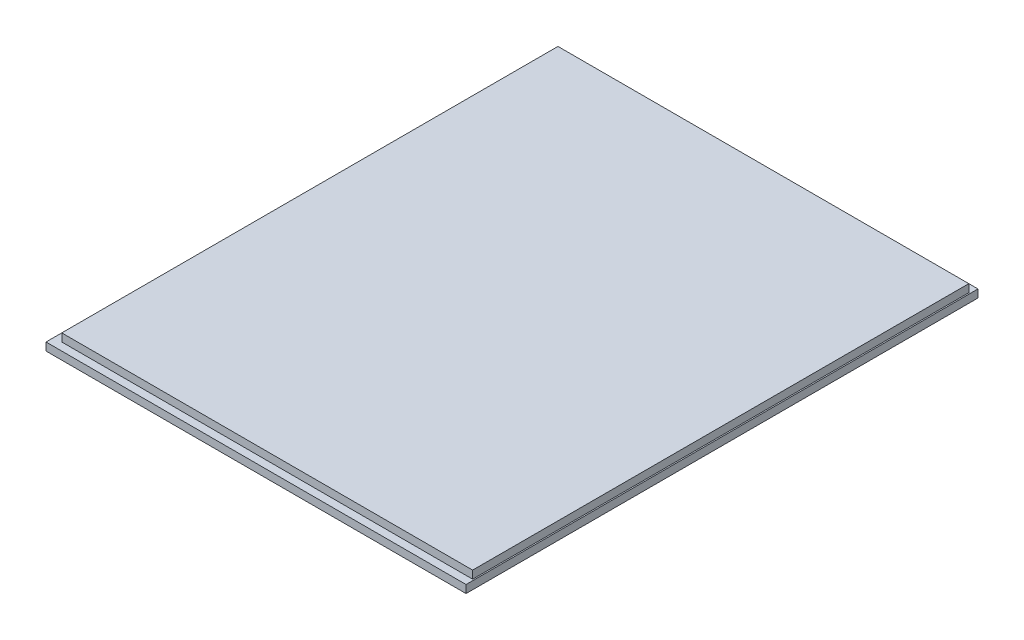
ISO-10303-21;
HEADER;
FILE_DESCRIPTION(('STEP AP214'),'2;1');
FILE_NAME('part.step','',(''),(''),'','','');
FILE_SCHEMA(('AUTOMOTIVE_DESIGN { 1 0 10303 214 1 1 1 1 }'));
ENDSEC;
DATA;
#1=APPLICATION_CONTEXT('core data for automotive mechanical design processes');
#2=APPLICATION_PROTOCOL_DEFINITION('international standard','automotive_design',2000,#1);
#3=PRODUCT_CONTEXT('',#1,'mechanical');
#4=PRODUCT('Part','Part','',(#3));
#5=PRODUCT_RELATED_PRODUCT_CATEGORY('part','',(#4));
#6=PRODUCT_DEFINITION_FORMATION('','',#4);
#7=PRODUCT_DEFINITION_CONTEXT('part definition',#1,'design');
#8=PRODUCT_DEFINITION('design','',#6,#7);
#9=PRODUCT_DEFINITION_SHAPE('','',#8);
#10=(LENGTH_UNIT() NAMED_UNIT(*) SI_UNIT(.MILLI.,.METRE.));
#11=(NAMED_UNIT(*) PLANE_ANGLE_UNIT() SI_UNIT($,.RADIAN.));
#12=(NAMED_UNIT(*) SI_UNIT($,.STERADIAN.) SOLID_ANGLE_UNIT());
#13=UNCERTAINTY_MEASURE_WITH_UNIT(LENGTH_MEASURE(1.E-05),#10,'distance_accuracy_value','');
#14=(GEOMETRIC_REPRESENTATION_CONTEXT(3) GLOBAL_UNCERTAINTY_ASSIGNED_CONTEXT((#13)) GLOBAL_UNIT_ASSIGNED_CONTEXT((#10,
#11,#12)) REPRESENTATION_CONTEXT('',''));
#15=CARTESIAN_POINT('',(0.,0.,0.));
#16=DIRECTION('',(0.,0.,1.));
#17=DIRECTION('',(1.,0.,0.));
#18=AXIS2_PLACEMENT_3D('',#15,#16,#17);
#19=CARTESIAN_POINT('',(-94.1664682539683,-3.81,-117.475));
#20=DIRECTION('',(1.,0.,0.));
#21=DIRECTION('',(0.,0.,-1.));
#22=AXIS2_PLACEMENT_3D('',#19,#20,#21);
#23=PLANE('',#22);
#24=DIRECTION('',(0.,0.,-1.));
#25=VECTOR('',#24,1.);
#26=CARTESIAN_POINT('',(-94.1664682539683,-3.81,-117.475));
#27=LINE('',#26,#25);
#28=CARTESIAN_POINT('',(-94.1664682539683,-3.81,115.444461816373));
#29=VERTEX_POINT('',#28);
#30=CARTESIAN_POINT('',(-94.1664682539683,-3.81,-115.444461816373));
#31=VERTEX_POINT('',#30);
#32=EDGE_CURVE('E53',#29,#31,#27,.T.);
#33=ORIENTED_EDGE('',*,*,#32,.T.);
#34=DIRECTION('',(0.,1.,0.));
#35=VECTOR('',#34,1.);
#36=CARTESIAN_POINT('',(-94.1664682539683,-304.925920325881,-115.444461816373));
#37=LINE('',#36,#35);
#38=CARTESIAN_POINT('',(-94.1664682539684,0.,-115.444461816374));
#39=VERTEX_POINT('',#38);
#40=EDGE_CURVE('E310',#31,#39,#37,.T.);
#41=ORIENTED_EDGE('',*,*,#40,.T.);
#42=DIRECTION('',(0.,0.,-1.));
#43=VECTOR('',#42,1.);
#44=CARTESIAN_POINT('',(-94.1664682539683,0.,-117.475));
#45=LINE('',#44,#43);
#46=CARTESIAN_POINT('',(-94.1664682539683,0.,115.444461816373));
#47=VERTEX_POINT('',#46);
#48=EDGE_CURVE('E337',#47,#39,#45,.T.);
#49=ORIENTED_EDGE('',*,*,#48,.F.);
#50=DIRECTION('',(0.,1.,0.));
#51=VECTOR('',#50,1.);
#52=CARTESIAN_POINT('',(-94.1664682539683,-304.925920325881,115.444461816373));
#53=LINE('',#52,#51);
#54=EDGE_CURVE('E61',#29,#47,#53,.T.);
#55=ORIENTED_EDGE('',*,*,#54,.F.);
#56=EDGE_LOOP('',(#33,#41,#49,#55));
#57=FACE_BOUND('',#56,.T.);
#58=ADVANCED_FACE('F38',(#57),#23,.T.);
#59=CARTESIAN_POINT('',(94.1664682539683,-3.81,-117.475));
#60=DIRECTION('',(0.,0.,1.));
#61=DIRECTION('',(1.,0.,0.));
#62=AXIS2_PLACEMENT_3D('',#59,#60,#61);
#63=PLANE('',#62);
#64=DIRECTION('',(1.,0.,0.));
#65=VECTOR('',#64,1.);
#66=CARTESIAN_POINT('',(94.1664682539683,-3.81,-117.475));
#67=LINE('',#66,#65);
#68=CARTESIAN_POINT('',(-92.5388146305852,-3.81,-117.475));
#69=VERTEX_POINT('',#68);
#70=CARTESIAN_POINT('',(92.5388146305852,-3.81,-117.475));
#71=VERTEX_POINT('',#70);
#72=EDGE_CURVE('E345',#69,#71,#67,.T.);
#73=ORIENTED_EDGE('',*,*,#72,.T.);
#74=DIRECTION('',(0.,1.,0.));
#75=VECTOR('',#74,1.);
#76=CARTESIAN_POINT('',(92.5388146305852,-304.925920325881,-117.475));
#77=LINE('',#76,#75);
#78=CARTESIAN_POINT('',(92.5388146305852,0.,-117.475));
#79=VERTEX_POINT('',#78);
#80=EDGE_CURVE('E299',#71,#79,#77,.T.);
#81=ORIENTED_EDGE('',*,*,#80,.T.);
#82=DIRECTION('',(1.,0.,0.));
#83=VECTOR('',#82,1.);
#84=CARTESIAN_POINT('',(94.1664682539683,0.,-117.475));
#85=LINE('',#84,#83);
#86=CARTESIAN_POINT('',(-92.5388146305852,0.,-117.475));
#87=VERTEX_POINT('',#86);
#88=EDGE_CURVE('E358',#87,#79,#85,.T.);
#89=ORIENTED_EDGE('',*,*,#88,.F.);
#90=DIRECTION('',(0.,1.,0.));
#91=VECTOR('',#90,1.);
#92=CARTESIAN_POINT('',(-92.5388146305852,-304.925920325881,-117.475));
#93=LINE('',#92,#91);
#94=EDGE_CURVE('E307',#69,#87,#93,.T.);
#95=ORIENTED_EDGE('',*,*,#94,.F.);
#96=EDGE_LOOP('',(#73,#81,#89,#95));
#97=FACE_BOUND('',#96,.T.);
#98=ADVANCED_FACE('F503',(#97),#63,.T.);
#99=CARTESIAN_POINT('',(94.1664682539683,-3.81,-117.475));
#100=DIRECTION('',(-1.,0.,0.));
#101=DIRECTION('',(0.,0.,1.));
#102=AXIS2_PLACEMENT_3D('',#99,#100,#101);
#103=PLANE('',#102);
#104=DIRECTION('',(0.,0.,1.));
#105=VECTOR('',#104,1.);
#106=CARTESIAN_POINT('',(94.1664682539683,-3.81,-117.475));
#107=LINE('',#106,#105);
#108=CARTESIAN_POINT('',(94.1664682539683,-3.81,-115.444461816373));
#109=VERTEX_POINT('',#108);
#110=CARTESIAN_POINT('',(94.1664682539683,-3.81,115.444461816373));
#111=VERTEX_POINT('',#110);
#112=EDGE_CURVE('E349',#109,#111,#107,.T.);
#113=ORIENTED_EDGE('',*,*,#112,.T.);
#114=DIRECTION('',(0.,1.,0.));
#115=VECTOR('',#114,1.);
#116=CARTESIAN_POINT('',(94.1664682539683,-304.925920325881,115.444461816373));
#117=LINE('',#116,#115);
#118=CARTESIAN_POINT('',(94.1664682539683,0.,115.444461816373));
#119=VERTEX_POINT('',#118);
#120=EDGE_CURVE('E333',#111,#119,#117,.T.);
#121=ORIENTED_EDGE('',*,*,#120,.T.);
#122=DIRECTION('',(0.,0.,1.));
#123=VECTOR('',#122,1.);
#124=CARTESIAN_POINT('',(94.1664682539683,0.,-117.475));
#125=LINE('',#124,#123);
#126=CARTESIAN_POINT('',(94.1664682539683,0.,-115.444461816373));
#127=VERTEX_POINT('',#126);
#128=EDGE_CURVE('E362',#127,#119,#125,.T.);
#129=ORIENTED_EDGE('',*,*,#128,.F.);
#130=DIRECTION('',(0.,1.,0.));
#131=VECTOR('',#130,1.);
#132=CARTESIAN_POINT('',(94.1664682539683,-304.925920325881,-115.444461816373));
#133=LINE('',#132,#131);
#134=EDGE_CURVE('E253',#109,#127,#133,.T.);
#135=ORIENTED_EDGE('',*,*,#134,.F.);
#136=EDGE_LOOP('',(#113,#121,#129,#135));
#137=FACE_BOUND('',#136,.T.);
#138=ADVANCED_FACE('F508',(#137),#103,.T.);
#139=CARTESIAN_POINT('',(94.1664682539683,-3.81,117.475));
#140=DIRECTION('',(0.,0.,-1.));
#141=DIRECTION('',(-1.,0.,0.));
#142=AXIS2_PLACEMENT_3D('',#139,#140,#141);
#143=PLANE('',#142);
#144=DIRECTION('',(-1.,0.,0.));
#145=VECTOR('',#144,1.);
#146=CARTESIAN_POINT('',(94.1664682539683,-3.81,117.475));
#147=LINE('',#146,#145);
#148=CARTESIAN_POINT('',(92.5388146305851,-3.81,117.475));
#149=VERTEX_POINT('',#148);
#150=CARTESIAN_POINT('',(-92.5388146305852,-3.81,117.475));
#151=VERTEX_POINT('',#150);
#152=EDGE_CURVE('E351',#149,#151,#147,.T.);
#153=ORIENTED_EDGE('',*,*,#152,.T.);
#154=DIRECTION('',(0.,1.,0.));
#155=VECTOR('',#154,1.);
#156=CARTESIAN_POINT('',(-92.5388146305852,-304.925920325881,117.475));
#157=LINE('',#156,#155);
#158=CARTESIAN_POINT('',(-92.5388146305852,0.,117.475));
#159=VERTEX_POINT('',#158);
#160=EDGE_CURVE('E321',#151,#159,#157,.T.);
#161=ORIENTED_EDGE('',*,*,#160,.T.);
#162=DIRECTION('',(-1.,0.,0.));
#163=VECTOR('',#162,1.);
#164=CARTESIAN_POINT('',(94.1664682539683,0.,117.475));
#165=LINE('',#164,#163);
#166=CARTESIAN_POINT('',(92.5388146305851,0.,117.475));
#167=VERTEX_POINT('',#166);
#168=EDGE_CURVE('E346',#167,#159,#165,.T.);
#169=ORIENTED_EDGE('',*,*,#168,.F.);
#170=DIRECTION('',(0.,1.,0.));
#171=VECTOR('',#170,1.);
#172=CARTESIAN_POINT('',(92.5388146305851,-304.925920325881,117.475));
#173=LINE('',#172,#171);
#174=EDGE_CURVE('E330',#149,#167,#173,.T.);
#175=ORIENTED_EDGE('',*,*,#174,.F.);
#176=EDGE_LOOP('',(#153,#161,#169,#175));
#177=FACE_BOUND('',#176,.T.);
#178=ADVANCED_FACE('F776',(#177),#143,.T.);
#179=CARTESIAN_POINT('',(0.,0.,0.));
#180=DIRECTION('',(0.,1.,0.));
#181=DIRECTION('',(0.,0.,1.));
#182=AXIS2_PLACEMENT_3D('',#179,#180,#181);
#183=PLANE('',#182);
#184=DIRECTION('',(0.625449947329634,0.,-0.780264290728057));
#185=VECTOR('',#184,1.);
#186=CARTESIAN_POINT('',(92.5388146305852,0.,-117.475));
#187=LINE('',#186,#185);
#188=CARTESIAN_POINT('',(19.4474117164525,0.,-26.2916656714782));
#189=VERTEX_POINT('',#188);
#190=EDGE_CURVE('E296',#189,#79,#187,.T.);
#191=ORIENTED_EDGE('',*,*,#190,.F.);
#192=CARTESIAN_POINT('',(0.,0.,0.));
#193=DIRECTION('',(0.,-1.,0.));
#194=DIRECTION('',(0.,0.,-1.));
#195=AXIS2_PLACEMENT_3D('',#192,#193,#194);
#196=CIRCLE('',#195,32.7025);
#197=CARTESIAN_POINT('',(-19.4474117164525,0.,-26.2916656714782));
#198=VERTEX_POINT('',#197);
#199=EDGE_CURVE('E293',#198,#189,#196,.T.);
#200=ORIENTED_EDGE('',*,*,#199,.F.);
#201=DIRECTION('',(0.625449947329634,0.,0.780264290728057));
#202=VECTOR('',#201,1.);
#203=CARTESIAN_POINT('',(-19.4474117164525,0.,-26.2916656714782));
#204=LINE('',#203,#202);
#205=EDGE_CURVE('E289',#87,#198,#204,.T.);
#206=ORIENTED_EDGE('',*,*,#205,.F.);
#207=ORIENTED_EDGE('',*,*,#88,.T.);
#208=EDGE_LOOP('',(#191,#200,#206,#207));
#209=FACE_BOUND('',#208,.T.);
#210=ADVANCED_FACE('F558',(#209),#183,.F.);
#211=DIRECTION('',(-0.625449947329634,0.,-0.780264290728057));
#212=VECTOR('',#211,1.);
#213=CARTESIAN_POINT('',(-94.1664682539683,0.,-115.444461816373));
#214=LINE('',#213,#212);
#215=CARTESIAN_POINT('',(-21.4292830149018,0.,-24.7030228052609));
#216=VERTEX_POINT('',#215);
#217=EDGE_CURVE('E285',#216,#39,#214,.T.);
#218=ORIENTED_EDGE('',*,*,#217,.F.);
#219=CARTESIAN_POINT('',(0.,0.,0.));
#220=DIRECTION('',(0.,-1.,0.));
#221=DIRECTION('',(0.,0.,-1.));
#222=AXIS2_PLACEMENT_3D('',#219,#220,#221);
#223=CIRCLE('',#222,32.7025);
#224=CARTESIAN_POINT('',(-21.4292830149019,0.,24.7030228052609));
#225=VERTEX_POINT('',#224);
#226=EDGE_CURVE('E281',#225,#216,#223,.T.);
#227=ORIENTED_EDGE('',*,*,#226,.F.);
#228=DIRECTION('',(0.625449947329634,0.,-0.780264290728057));
#229=VECTOR('',#228,1.);
#230=CARTESIAN_POINT('',(-21.4292830149019,0.,24.7030228052609));
#231=LINE('',#230,#229);
#232=EDGE_CURVE('E277',#47,#225,#231,.T.);
#233=ORIENTED_EDGE('',*,*,#232,.F.);
#234=ORIENTED_EDGE('',*,*,#48,.T.);
#235=EDGE_LOOP('',(#218,#227,#233,#234));
#236=FACE_BOUND('',#235,.T.);
#237=ADVANCED_FACE('F792',(#236),#183,.F.);
#238=DIRECTION('',(-0.625449947329634,0.,0.780264290728057));
#239=VECTOR('',#238,1.);
#240=CARTESIAN_POINT('',(-92.5388146305852,0.,117.475));
#241=LINE('',#240,#239);
#242=CARTESIAN_POINT('',(-19.4474117164526,0.,26.2916656714782));
#243=VERTEX_POINT('',#242);
#244=EDGE_CURVE('E273',#243,#159,#241,.T.);
#245=ORIENTED_EDGE('',*,*,#244,.F.);
#246=CARTESIAN_POINT('',(0.,0.,0.));
#247=DIRECTION('',(0.,-1.,0.));
#248=DIRECTION('',(0.,0.,-1.));
#249=AXIS2_PLACEMENT_3D('',#246,#247,#248);
#250=CIRCLE('',#249,32.7025);
#251=CARTESIAN_POINT('',(19.4474117164526,0.,26.2916656714782));
#252=VERTEX_POINT('',#251);
#253=EDGE_CURVE('E270',#252,#243,#250,.T.);
#254=ORIENTED_EDGE('',*,*,#253,.F.);
#255=DIRECTION('',(-0.625449947329634,0.,-0.780264290728057));
#256=VECTOR('',#255,1.);
#257=CARTESIAN_POINT('',(19.4474117164526,0.,26.2916656714782));
#258=LINE('',#257,#256);
#259=EDGE_CURVE('E267',#167,#252,#258,.T.);
#260=ORIENTED_EDGE('',*,*,#259,.F.);
#261=ORIENTED_EDGE('',*,*,#168,.T.);
#262=EDGE_LOOP('',(#245,#254,#260,#261));
#263=FACE_BOUND('',#262,.T.);
#264=ADVANCED_FACE('F711',(#263),#183,.F.);
#265=DIRECTION('',(0.,0.,-1.));
#266=VECTOR('',#265,1.);
#267=CARTESIAN_POINT('',(100.0125,0.,-123.825));
#268=LINE('',#267,#266);
#269=CARTESIAN_POINT('',(100.0125,0.,123.825));
#270=VERTEX_POINT('',#269);
#271=CARTESIAN_POINT('',(100.0125,0.,-123.825));
#272=VERTEX_POINT('',#271);
#273=EDGE_CURVE('E442',#270,#272,#268,.T.);
#274=ORIENTED_EDGE('',*,*,#273,.F.);
#275=DIRECTION('',(1.,0.,0.));
#276=VECTOR('',#275,1.);
#277=CARTESIAN_POINT('',(-103.1875,0.,123.825));
#278=LINE('',#277,#276);
#279=CARTESIAN_POINT('',(-103.1875,0.,123.825));
#280=VERTEX_POINT('',#279);
#281=EDGE_CURVE('E447',#280,#270,#278,.T.);
#282=ORIENTED_EDGE('',*,*,#281,.F.);
#283=DIRECTION('',(0.,0.,1.));
#284=VECTOR('',#283,1.);
#285=CARTESIAN_POINT('',(-103.1875,0.,-123.825));
#286=LINE('',#285,#284);
#287=CARTESIAN_POINT('',(-103.1875,0.,-123.825));
#288=VERTEX_POINT('',#287);
#289=EDGE_CURVE('E462',#288,#280,#286,.T.);
#290=ORIENTED_EDGE('',*,*,#289,.F.);
#291=DIRECTION('',(-1.,0.,0.));
#292=VECTOR('',#291,1.);
#293=CARTESIAN_POINT('',(-103.1875,0.,-123.825));
#294=LINE('',#293,#292);
#295=EDGE_CURVE('E459',#272,#288,#294,.T.);
#296=ORIENTED_EDGE('',*,*,#295,.F.);
#297=EDGE_LOOP('',(#274,#282,#290,#296));
#298=FACE_BOUND('',#297,.T.);
#299=DIRECTION('',(0.,0.,-1.));
#300=VECTOR('',#299,1.);
#301=CARTESIAN_POINT('',(-96.2025000000001,0.,-120.015));
#302=LINE('',#301,#300);
#303=CARTESIAN_POINT('',(-96.2025000000001,0.,120.015));
#304=VERTEX_POINT('',#303);
#305=CARTESIAN_POINT('',(-96.2025000000001,0.,-120.015));
#306=VERTEX_POINT('',#305);
#307=EDGE_CURVE('E354',#304,#306,#302,.T.);
#308=ORIENTED_EDGE('',*,*,#307,.F.);
#309=DIRECTION('',(-1.,0.,0.));
#310=VECTOR('',#309,1.);
#311=CARTESIAN_POINT('',(96.2025,0.,120.015));
#312=LINE('',#311,#310);
#313=CARTESIAN_POINT('',(96.2025,0.,120.015));
#314=VERTEX_POINT('',#313);
#315=EDGE_CURVE('E372',#314,#304,#312,.T.);
#316=ORIENTED_EDGE('',*,*,#315,.F.);
#317=DIRECTION('',(0.,0.,1.));
#318=VECTOR('',#317,1.);
#319=CARTESIAN_POINT('',(96.2025,0.,-120.015));
#320=LINE('',#319,#318);
#321=CARTESIAN_POINT('',(96.2025,0.,-120.015));
#322=VERTEX_POINT('',#321);
#323=EDGE_CURVE('E388',#322,#314,#320,.T.);
#324=ORIENTED_EDGE('',*,*,#323,.F.);
#325=DIRECTION('',(1.,0.,0.));
#326=VECTOR('',#325,1.);
#327=CARTESIAN_POINT('',(96.2025,0.,-120.015));
#328=LINE('',#327,#326);
#329=EDGE_CURVE('E384',#306,#322,#328,.T.);
#330=ORIENTED_EDGE('',*,*,#329,.F.);
#331=EDGE_LOOP('',(#308,#316,#324,#330));
#332=FACE_BOUND('',#331,.T.);
#333=ADVANCED_FACE('F483',(#298,#332),#183,.F.);
#334=CARTESIAN_POINT('',(0.,3.81,0.));
#335=DIRECTION('',(0.,1.,0.));
#336=DIRECTION('',(0.,0.,1.));
#337=AXIS2_PLACEMENT_3D('',#334,#335,#336);
#338=PLANE('',#337);
#339=DIRECTION('',(0.,0.,-1.));
#340=VECTOR('',#339,1.);
#341=CARTESIAN_POINT('',(100.0125,3.81,-123.825));
#342=LINE('',#341,#340);
#343=CARTESIAN_POINT('',(100.0125,3.81,123.825));
#344=VERTEX_POINT('',#343);
#345=CARTESIAN_POINT('',(100.0125,3.81,-123.825));
#346=VERTEX_POINT('',#345);
#347=EDGE_CURVE('E443',#344,#346,#342,.T.);
#348=ORIENTED_EDGE('',*,*,#347,.T.);
#349=DIRECTION('',(-1.,0.,0.));
#350=VECTOR('',#349,1.);
#351=CARTESIAN_POINT('',(-103.1875,3.81,-123.825));
#352=LINE('',#351,#350);
#353=CARTESIAN_POINT('',(-103.1875,3.81,-123.825));
#354=VERTEX_POINT('',#353);
#355=EDGE_CURVE('E446',#346,#354,#352,.T.);
#356=ORIENTED_EDGE('',*,*,#355,.T.);
#357=DIRECTION('',(0.,0.,1.));
#358=VECTOR('',#357,1.);
#359=CARTESIAN_POINT('',(-103.1875,3.81,-123.825));
#360=LINE('',#359,#358);
#361=CARTESIAN_POINT('',(-103.1875,3.81,123.825));
#362=VERTEX_POINT('',#361);
#363=EDGE_CURVE('E450',#354,#362,#360,.T.);
#364=ORIENTED_EDGE('',*,*,#363,.T.);
#365=DIRECTION('',(1.,0.,0.));
#366=VECTOR('',#365,1.);
#367=CARTESIAN_POINT('',(-103.1875,3.81,123.825));
#368=LINE('',#367,#366);
#369=EDGE_CURVE('E453',#362,#344,#368,.T.);
#370=ORIENTED_EDGE('',*,*,#369,.T.);
#371=EDGE_LOOP('',(#348,#356,#364,#370));
#372=FACE_BOUND('',#371,.T.);
#373=DIRECTION('',(-1.,0.,0.));
#374=VECTOR('',#373,1.);
#375=CARTESIAN_POINT('',(-99.3775,3.81,-120.015));
#376=LINE('',#375,#374);
#377=CARTESIAN_POINT('',(99.3775,3.81,-120.015));
#378=VERTEX_POINT('',#377);
#379=CARTESIAN_POINT('',(-99.3775,3.81,-120.015));
#380=VERTEX_POINT('',#379);
#381=EDGE_CURVE('E423',#378,#380,#376,.T.);
#382=ORIENTED_EDGE('',*,*,#381,.F.);
#383=DIRECTION('',(0.,0.,-1.));
#384=VECTOR('',#383,1.);
#385=CARTESIAN_POINT('',(99.3775,3.81,120.015));
#386=LINE('',#385,#384);
#387=CARTESIAN_POINT('',(99.3775,3.81,120.015));
#388=VERTEX_POINT('',#387);
#389=EDGE_CURVE('E406',#388,#378,#386,.T.);
#390=ORIENTED_EDGE('',*,*,#389,.F.);
#391=DIRECTION('',(1.,0.,0.));
#392=VECTOR('',#391,1.);
#393=CARTESIAN_POINT('',(-99.3775,3.81,120.015));
#394=LINE('',#393,#392);
#395=CARTESIAN_POINT('',(-99.3775,3.81,120.015));
#396=VERTEX_POINT('',#395);
#397=EDGE_CURVE('E411',#396,#388,#394,.T.);
#398=ORIENTED_EDGE('',*,*,#397,.F.);
#399=DIRECTION('',(0.,0.,1.));
#400=VECTOR('',#399,1.);
#401=CARTESIAN_POINT('',(-99.3775,3.81,120.015));
#402=LINE('',#401,#400);
#403=EDGE_CURVE('E426',#380,#396,#402,.T.);
#404=ORIENTED_EDGE('',*,*,#403,.F.);
#405=EDGE_LOOP('',(#382,#390,#398,#404));
#406=FACE_BOUND('',#405,.T.);
#407=ADVANCED_FACE('F493',(#372,#406),#338,.T.);
#408=CARTESIAN_POINT('',(100.0125,3.81,-123.825));
#409=DIRECTION('',(-1.,0.,0.));
#410=DIRECTION('',(0.,0.,1.));
#411=AXIS2_PLACEMENT_3D('',#408,#409,#410);
#412=PLANE('',#411);
#413=ORIENTED_EDGE('',*,*,#273,.T.);
#414=DIRECTION('',(0.,-1.,0.));
#415=VECTOR('',#414,1.);
#416=CARTESIAN_POINT('',(100.0125,3.81,-123.825));
#417=LINE('',#416,#415);
#418=EDGE_CURVE('E11',#346,#272,#417,.T.);
#419=ORIENTED_EDGE('',*,*,#418,.F.);
#420=ORIENTED_EDGE('',*,*,#347,.F.);
#421=DIRECTION('',(0.,-1.,0.));
#422=VECTOR('',#421,1.);
#423=CARTESIAN_POINT('',(100.0125,3.81,123.825));
#424=LINE('',#423,#422);
#425=EDGE_CURVE('E456',#344,#270,#424,.T.);
#426=ORIENTED_EDGE('',*,*,#425,.T.);
#427=EDGE_LOOP('',(#413,#419,#420,#426));
#428=FACE_BOUND('',#427,.T.);
#429=ADVANCED_FACE('F40',(#428),#412,.F.);
#430=CARTESIAN_POINT('',(-103.1875,3.81,-123.825));
#431=DIRECTION('',(0.,0.,1.));
#432=DIRECTION('',(1.,0.,0.));
#433=AXIS2_PLACEMENT_3D('',#430,#431,#432);
#434=PLANE('',#433);
#435=ORIENTED_EDGE('',*,*,#295,.T.);
#436=DIRECTION('',(0.,-1.,0.));
#437=VECTOR('',#436,1.);
#438=CARTESIAN_POINT('',(-103.1875,3.81,-123.825));
#439=LINE('',#438,#437);
#440=EDGE_CURVE('E46',#354,#288,#439,.T.);
#441=ORIENTED_EDGE('',*,*,#440,.F.);
#442=ORIENTED_EDGE('',*,*,#355,.F.);
#443=ORIENTED_EDGE('',*,*,#418,.T.);
#444=EDGE_LOOP('',(#435,#441,#442,#443));
#445=FACE_BOUND('',#444,.T.);
#446=ADVANCED_FACE('F495',(#445),#434,.F.);
#447=CARTESIAN_POINT('',(-103.1875,3.81,-123.825));
#448=DIRECTION('',(1.,0.,0.));
#449=DIRECTION('',(0.,0.,-1.));
#450=AXIS2_PLACEMENT_3D('',#447,#448,#449);
#451=PLANE('',#450);
#452=ORIENTED_EDGE('',*,*,#289,.T.);
#453=DIRECTION('',(0.,-1.,0.));
#454=VECTOR('',#453,1.);
#455=CARTESIAN_POINT('',(-103.1875,3.81,123.825));
#456=LINE('',#455,#454);
#457=EDGE_CURVE('E469',#362,#280,#456,.T.);
#458=ORIENTED_EDGE('',*,*,#457,.F.);
#459=ORIENTED_EDGE('',*,*,#363,.F.);
#460=ORIENTED_EDGE('',*,*,#440,.T.);
#461=EDGE_LOOP('',(#452,#458,#459,#460));
#462=FACE_BOUND('',#461,.T.);
#463=ADVANCED_FACE('F477',(#462),#451,.F.);
#464=CARTESIAN_POINT('',(-103.1875,3.81,123.825));
#465=DIRECTION('',(0.,0.,-1.));
#466=DIRECTION('',(-1.,0.,0.));
#467=AXIS2_PLACEMENT_3D('',#464,#465,#466);
#468=PLANE('',#467);
#469=ORIENTED_EDGE('',*,*,#281,.T.);
#470=ORIENTED_EDGE('',*,*,#425,.F.);
#471=ORIENTED_EDGE('',*,*,#369,.F.);
#472=ORIENTED_EDGE('',*,*,#457,.T.);
#473=EDGE_LOOP('',(#469,#470,#471,#472));
#474=FACE_BOUND('',#473,.T.);
#475=ADVANCED_FACE('F487',(#474),#468,.F.);
#476=CARTESIAN_POINT('',(99.3775,7.62,120.015));
#477=DIRECTION('',(-1.,0.,0.));
#478=DIRECTION('',(0.,0.,1.));
#479=AXIS2_PLACEMENT_3D('',#476,#477,#478);
#480=PLANE('',#479);
#481=ORIENTED_EDGE('',*,*,#389,.T.);
#482=DIRECTION('',(0.,-1.,0.));
#483=VECTOR('',#482,1.);
#484=CARTESIAN_POINT('',(99.3775,7.62,-120.015));
#485=LINE('',#484,#483);
#486=CARTESIAN_POINT('',(99.3775,7.62,-120.015));
#487=VERTEX_POINT('',#486);
#488=EDGE_CURVE('E440',#487,#378,#485,.T.);
#489=ORIENTED_EDGE('',*,*,#488,.F.);
#490=DIRECTION('',(0.,0.,-1.));
#491=VECTOR('',#490,1.);
#492=CARTESIAN_POINT('',(99.3775,7.62,120.015));
#493=LINE('',#492,#491);
#494=CARTESIAN_POINT('',(99.3775,7.62,120.015));
#495=VERTEX_POINT('',#494);
#496=EDGE_CURVE('E407',#495,#487,#493,.T.);
#497=ORIENTED_EDGE('',*,*,#496,.F.);
#498=DIRECTION('',(0.,-1.,0.));
#499=VECTOR('',#498,1.);
#500=CARTESIAN_POINT('',(99.3775,7.62,120.015));
#501=LINE('',#500,#499);
#502=EDGE_CURVE('E420',#495,#388,#501,.T.);
#503=ORIENTED_EDGE('',*,*,#502,.T.);
#504=EDGE_LOOP('',(#481,#489,#497,#503));
#505=FACE_BOUND('',#504,.T.);
#506=ADVANCED_FACE('F548',(#505),#480,.F.);
#507=CARTESIAN_POINT('',(-99.3775,7.62,-120.015));
#508=DIRECTION('',(0.,0.,1.));
#509=DIRECTION('',(1.,0.,0.));
#510=AXIS2_PLACEMENT_3D('',#507,#508,#509);
#511=PLANE('',#510);
#512=ORIENTED_EDGE('',*,*,#381,.T.);
#513=DIRECTION('',(0.,-1.,0.));
#514=VECTOR('',#513,1.);
#515=CARTESIAN_POINT('',(-99.3775,7.62,-120.015));
#516=LINE('',#515,#514);
#517=CARTESIAN_POINT('',(-99.3775,7.62,-120.015));
#518=VERTEX_POINT('',#517);
#519=EDGE_CURVE('E437',#518,#380,#516,.T.);
#520=ORIENTED_EDGE('',*,*,#519,.F.);
#521=DIRECTION('',(-1.,0.,0.));
#522=VECTOR('',#521,1.);
#523=CARTESIAN_POINT('',(-99.3775,7.62,-120.015));
#524=LINE('',#523,#522);
#525=EDGE_CURVE('E410',#487,#518,#524,.T.);
#526=ORIENTED_EDGE('',*,*,#525,.F.);
#527=ORIENTED_EDGE('',*,*,#488,.T.);
#528=EDGE_LOOP('',(#512,#520,#526,#527));
#529=FACE_BOUND('',#528,.T.);
#530=ADVANCED_FACE('F544',(#529),#511,.F.);
#531=CARTESIAN_POINT('',(-99.3775,7.62,120.015));
#532=DIRECTION('',(1.,0.,0.));
#533=DIRECTION('',(0.,0.,-1.));
#534=AXIS2_PLACEMENT_3D('',#531,#532,#533);
#535=PLANE('',#534);
#536=ORIENTED_EDGE('',*,*,#403,.T.);
#537=DIRECTION('',(0.,-1.,0.));
#538=VECTOR('',#537,1.);
#539=CARTESIAN_POINT('',(-99.3775,7.62,120.015));
#540=LINE('',#539,#538);
#541=CARTESIAN_POINT('',(-99.3775,7.62,120.015));
#542=VERTEX_POINT('',#541);
#543=EDGE_CURVE('E434',#542,#396,#540,.T.);
#544=ORIENTED_EDGE('',*,*,#543,.F.);
#545=DIRECTION('',(0.,0.,1.));
#546=VECTOR('',#545,1.);
#547=CARTESIAN_POINT('',(-99.3775,7.62,120.015));
#548=LINE('',#547,#546);
#549=EDGE_CURVE('E414',#518,#542,#548,.T.);
#550=ORIENTED_EDGE('',*,*,#549,.F.);
#551=ORIENTED_EDGE('',*,*,#519,.T.);
#552=EDGE_LOOP('',(#536,#544,#550,#551));
#553=FACE_BOUND('',#552,.T.);
#554=ADVANCED_FACE('F540',(#553),#535,.F.);
#555=CARTESIAN_POINT('',(-99.3775,7.62,120.015));
#556=DIRECTION('',(0.,0.,-1.));
#557=DIRECTION('',(-1.,0.,0.));
#558=AXIS2_PLACEMENT_3D('',#555,#556,#557);
#559=PLANE('',#558);
#560=ORIENTED_EDGE('',*,*,#397,.T.);
#561=ORIENTED_EDGE('',*,*,#502,.F.);
#562=DIRECTION('',(1.,0.,0.));
#563=VECTOR('',#562,1.);
#564=CARTESIAN_POINT('',(-99.3775,7.62,120.015));
#565=LINE('',#564,#563);
#566=EDGE_CURVE('E417',#542,#495,#565,.T.);
#567=ORIENTED_EDGE('',*,*,#566,.F.);
#568=ORIENTED_EDGE('',*,*,#543,.T.);
#569=EDGE_LOOP('',(#560,#561,#567,#568));
#570=FACE_BOUND('',#569,.T.);
#571=ADVANCED_FACE('F536',(#570),#559,.F.);
#572=CARTESIAN_POINT('',(0.,7.62,0.));
#573=DIRECTION('',(0.,-1.,0.));
#574=DIRECTION('',(0.,0.,-1.));
#575=AXIS2_PLACEMENT_3D('',#572,#573,#574);
#576=PLANE('',#575);
#577=ORIENTED_EDGE('',*,*,#496,.T.);
#578=ORIENTED_EDGE('',*,*,#525,.T.);
#579=ORIENTED_EDGE('',*,*,#549,.T.);
#580=ORIENTED_EDGE('',*,*,#566,.T.);
#581=EDGE_LOOP('',(#577,#578,#579,#580));
#582=FACE_BOUND('',#581,.T.);
#583=ADVANCED_FACE('F517',(#582),#576,.F.);
#584=CARTESIAN_POINT('',(0.,-3.81,0.));
#585=DIRECTION('',(0.,-1.,0.));
#586=DIRECTION('',(0.,0.,-1.));
#587=AXIS2_PLACEMENT_3D('',#584,#585,#586);
#588=PLANE('',#587);
#589=ORIENTED_EDGE('',*,*,#32,.F.);
#590=DIRECTION('',(0.625449947329634,0.,-0.780264290728057));
#591=VECTOR('',#590,1.);
#592=CARTESIAN_POINT('',(-21.4292830149019,-3.80999999999998,24.7030228052609));
#593=LINE('',#592,#591);
#594=CARTESIAN_POINT('',(-21.4292830149019,-3.80999999999998,24.7030228052609));
#595=VERTEX_POINT('',#594);
#596=EDGE_CURVE('E873',#29,#595,#593,.T.);
#597=ORIENTED_EDGE('',*,*,#596,.T.);
#598=CARTESIAN_POINT('',(0.,-3.80999999999998,0.));
#599=DIRECTION('',(0.,-1.,0.));
#600=DIRECTION('',(0.,0.,-1.));
#601=AXIS2_PLACEMENT_3D('',#598,#599,#600);
#602=CIRCLE('',#601,32.7025);
#603=CARTESIAN_POINT('',(-21.4292830149018,-3.80999999999998,-24.7030228052609));
#604=VERTEX_POINT('',#603);
#605=EDGE_CURVE('E879',#595,#604,#602,.T.);
#606=ORIENTED_EDGE('',*,*,#605,.T.);
#607=DIRECTION('',(-0.625449947329634,0.,-0.780264290728057));
#608=VECTOR('',#607,1.);
#609=CARTESIAN_POINT('',(-94.1664682539683,-3.80999999999998,-115.444461816373));
#610=LINE('',#609,#608);
#611=EDGE_CURVE('E893',#604,#31,#610,.T.);
#612=ORIENTED_EDGE('',*,*,#611,.T.);
#613=EDGE_LOOP('',(#589,#597,#606,#612));
#614=FACE_BOUND('',#613,.T.);
#615=ORIENTED_EDGE('',*,*,#72,.F.);
#616=DIRECTION('',(0.625449947329634,0.,0.780264290728057));
#617=VECTOR('',#616,1.);
#618=CARTESIAN_POINT('',(-19.4474117164525,-3.80999999999998,-26.2916656714782));
#619=LINE('',#618,#617);
#620=CARTESIAN_POINT('',(-19.4474117164525,-3.80999999999998,-26.2916656714782));
#621=VERTEX_POINT('',#620);
#622=EDGE_CURVE('E897',#69,#621,#619,.T.);
#623=ORIENTED_EDGE('',*,*,#622,.T.);
#624=CARTESIAN_POINT('',(0.,-3.80999999999998,0.));
#625=DIRECTION('',(0.,-1.,0.));
#626=DIRECTION('',(0.,0.,-1.));
#627=AXIS2_PLACEMENT_3D('',#624,#625,#626);
#628=CIRCLE('',#627,32.7025);
#629=CARTESIAN_POINT('',(19.4474117164525,-3.80999999999998,-26.2916656714782));
#630=VERTEX_POINT('',#629);
#631=EDGE_CURVE('E901',#621,#630,#628,.T.);
#632=ORIENTED_EDGE('',*,*,#631,.T.);
#633=DIRECTION('',(0.625449947329634,0.,-0.780264290728057));
#634=VECTOR('',#633,1.);
#635=CARTESIAN_POINT('',(92.5388146305852,-3.80999999999998,-117.475));
#636=LINE('',#635,#634);
#637=EDGE_CURVE('E342',#630,#71,#636,.T.);
#638=ORIENTED_EDGE('',*,*,#637,.T.);
#639=EDGE_LOOP('',(#615,#623,#632,#638));
#640=FACE_BOUND('',#639,.T.);
#641=ORIENTED_EDGE('',*,*,#112,.F.);
#642=DIRECTION('',(-0.625449947329634,0.,0.780264290728057));
#643=VECTOR('',#642,1.);
#644=CARTESIAN_POINT('',(21.4292830149018,-3.80999999999998,-24.7030228052609));
#645=LINE('',#644,#643);
#646=CARTESIAN_POINT('',(21.4292830149018,-3.80999999999998,-24.7030228052609));
#647=VERTEX_POINT('',#646);
#648=EDGE_CURVE('E262',#109,#647,#645,.T.);
#649=ORIENTED_EDGE('',*,*,#648,.T.);
#650=CARTESIAN_POINT('',(0.,-3.80999999999998,0.));
#651=DIRECTION('',(0.,-1.,0.));
#652=DIRECTION('',(0.,0.,-1.));
#653=AXIS2_PLACEMENT_3D('',#650,#651,#652);
#654=CIRCLE('',#653,32.7025);
#655=CARTESIAN_POINT('',(21.4292830149019,-3.80999999999998,24.7030228052609));
#656=VERTEX_POINT('',#655);
#657=EDGE_CURVE('E249',#647,#656,#654,.T.);
#658=ORIENTED_EDGE('',*,*,#657,.T.);
#659=DIRECTION('',(0.625449947329634,0.,0.780264290728057));
#660=VECTOR('',#659,1.);
#661=CARTESIAN_POINT('',(94.1664682539683,-3.80999999999998,115.444461816373));
#662=LINE('',#661,#660);
#663=EDGE_CURVE('E884',#656,#111,#662,.T.);
#664=ORIENTED_EDGE('',*,*,#663,.T.);
#665=EDGE_LOOP('',(#641,#649,#658,#664));
#666=FACE_BOUND('',#665,.T.);
#667=ORIENTED_EDGE('',*,*,#152,.F.);
#668=DIRECTION('',(-0.625449947329634,0.,-0.780264290728057));
#669=VECTOR('',#668,1.);
#670=CARTESIAN_POINT('',(19.4474117164526,-3.80999999999998,26.2916656714782));
#671=LINE('',#670,#669);
#672=CARTESIAN_POINT('',(19.4474117164526,-3.80999999999998,26.2916656714782));
#673=VERTEX_POINT('',#672);
#674=EDGE_CURVE('E876',#149,#673,#671,.T.);
#675=ORIENTED_EDGE('',*,*,#674,.T.);
#676=CARTESIAN_POINT('',(0.,-3.80999999999998,0.));
#677=DIRECTION('',(0.,-1.,0.));
#678=DIRECTION('',(0.,0.,-1.));
#679=AXIS2_PLACEMENT_3D('',#676,#677,#678);
#680=CIRCLE('',#679,32.7025);
#681=CARTESIAN_POINT('',(-19.4474117164526,-3.80999999999998,26.2916656714782));
#682=VERTEX_POINT('',#681);
#683=EDGE_CURVE('E866',#673,#682,#680,.T.);
#684=ORIENTED_EDGE('',*,*,#683,.T.);
#685=DIRECTION('',(-0.625449947329634,0.,0.780264290728057));
#686=VECTOR('',#685,1.);
#687=CARTESIAN_POINT('',(-92.5388146305852,-3.80999999999998,117.475));
#688=LINE('',#687,#686);
#689=EDGE_CURVE('E863',#682,#151,#688,.T.);
#690=ORIENTED_EDGE('',*,*,#689,.T.);
#691=EDGE_LOOP('',(#667,#675,#684,#690));
#692=FACE_BOUND('',#691,.T.);
#693=DIRECTION('',(0.,0.,-1.));
#694=VECTOR('',#693,1.);
#695=CARTESIAN_POINT('',(-96.2025000000001,-3.81,-120.015));
#696=LINE('',#695,#694);
#697=CARTESIAN_POINT('',(-96.2025000000001,-3.81,120.015));
#698=VERTEX_POINT('',#697);
#699=CARTESIAN_POINT('',(-96.2025000000001,-3.81,-120.015));
#700=VERTEX_POINT('',#699);
#701=EDGE_CURVE('E367',#698,#700,#696,.T.);
#702=ORIENTED_EDGE('',*,*,#701,.T.);
#703=DIRECTION('',(1.,0.,0.));
#704=VECTOR('',#703,1.);
#705=CARTESIAN_POINT('',(96.2025,-3.81,-120.015));
#706=LINE('',#705,#704);
#707=CARTESIAN_POINT('',(96.2025,-3.81,-120.015));
#708=VERTEX_POINT('',#707);
#709=EDGE_CURVE('E371',#700,#708,#706,.T.);
#710=ORIENTED_EDGE('',*,*,#709,.T.);
#711=DIRECTION('',(0.,0.,1.));
#712=VECTOR('',#711,1.);
#713=CARTESIAN_POINT('',(96.2025,-3.81,-120.015));
#714=LINE('',#713,#712);
#715=CARTESIAN_POINT('',(96.2025,-3.81,120.015));
#716=VERTEX_POINT('',#715);
#717=EDGE_CURVE('E375',#708,#716,#714,.T.);
#718=ORIENTED_EDGE('',*,*,#717,.T.);
#719=DIRECTION('',(-1.,0.,0.));
#720=VECTOR('',#719,1.);
#721=CARTESIAN_POINT('',(96.2025,-3.81,120.015));
#722=LINE('',#721,#720);
#723=EDGE_CURVE('E377',#716,#698,#722,.T.);
#724=ORIENTED_EDGE('',*,*,#723,.T.);
#725=EDGE_LOOP('',(#702,#710,#718,#724));
#726=FACE_BOUND('',#725,.T.);
#727=CARTESIAN_POINT('',(0.,-3.80999999999998,0.));
#728=DIRECTION('',(0.,-1.,0.));
#729=DIRECTION('',(0.,0.,-1.));
#730=AXIS2_PLACEMENT_3D('',#727,#728,#729);
#731=CIRCLE('',#730,30.1625);
#732=CARTESIAN_POINT('',(0.,-3.80999999999998,-30.1625));
#733=VERTEX_POINT('',#732);
#734=EDGE_CURVE('E338',#733,#733,#731,.T.);
#735=ORIENTED_EDGE('',*,*,#734,.F.);
#736=EDGE_LOOP('',(#735));
#737=FACE_BOUND('',#736,.T.);
#738=ADVANCED_FACE('F513',(#614,#640,#666,#692,#726,#737),#588,.T.);
#739=CARTESIAN_POINT('',(-96.2025000000001,-3.81,-120.015));
#740=DIRECTION('',(1.,0.,0.));
#741=DIRECTION('',(0.,0.,-1.));
#742=AXIS2_PLACEMENT_3D('',#739,#740,#741);
#743=PLANE('',#742);
#744=ORIENTED_EDGE('',*,*,#307,.T.);
#745=DIRECTION('',(0.,1.,0.));
#746=VECTOR('',#745,1.);
#747=CARTESIAN_POINT('',(-96.2025000000001,-3.81,-120.015));
#748=LINE('',#747,#746);
#749=EDGE_CURVE('E403',#700,#306,#748,.T.);
#750=ORIENTED_EDGE('',*,*,#749,.F.);
#751=ORIENTED_EDGE('',*,*,#701,.F.);
#752=DIRECTION('',(0.,1.,0.));
#753=VECTOR('',#752,1.);
#754=CARTESIAN_POINT('',(-96.2025000000001,-3.81,120.015));
#755=LINE('',#754,#753);
#756=EDGE_CURVE('E380',#698,#304,#755,.T.);
#757=ORIENTED_EDGE('',*,*,#756,.T.);
#758=EDGE_LOOP('',(#744,#750,#751,#757));
#759=FACE_BOUND('',#758,.T.);
#760=ADVANCED_FACE('F516',(#759),#743,.F.);
#761=CARTESIAN_POINT('',(96.2025,-3.81,-120.015));
#762=DIRECTION('',(0.,0.,1.));
#763=DIRECTION('',(1.,0.,0.));
#764=AXIS2_PLACEMENT_3D('',#761,#762,#763);
#765=PLANE('',#764);
#766=ORIENTED_EDGE('',*,*,#329,.T.);
#767=DIRECTION('',(0.,1.,0.));
#768=VECTOR('',#767,1.);
#769=CARTESIAN_POINT('',(96.2025,-3.81,-120.015));
#770=LINE('',#769,#768);
#771=EDGE_CURVE('E400',#708,#322,#770,.T.);
#772=ORIENTED_EDGE('',*,*,#771,.F.);
#773=ORIENTED_EDGE('',*,*,#709,.F.);
#774=ORIENTED_EDGE('',*,*,#749,.T.);
#775=EDGE_LOOP('',(#766,#772,#773,#774));
#776=FACE_BOUND('',#775,.T.);
#777=ADVANCED_FACE('F526',(#776),#765,.F.);
#778=CARTESIAN_POINT('',(96.2025,-3.81,-120.015));
#779=DIRECTION('',(-1.,0.,0.));
#780=DIRECTION('',(0.,0.,1.));
#781=AXIS2_PLACEMENT_3D('',#778,#779,#780);
#782=PLANE('',#781);
#783=ORIENTED_EDGE('',*,*,#323,.T.);
#784=DIRECTION('',(0.,1.,0.));
#785=VECTOR('',#784,1.);
#786=CARTESIAN_POINT('',(96.2025,-3.81,120.015));
#787=LINE('',#786,#785);
#788=EDGE_CURVE('E397',#716,#314,#787,.T.);
#789=ORIENTED_EDGE('',*,*,#788,.F.);
#790=ORIENTED_EDGE('',*,*,#717,.F.);
#791=ORIENTED_EDGE('',*,*,#771,.T.);
#792=EDGE_LOOP('',(#783,#789,#790,#791));
#793=FACE_BOUND('',#792,.T.);
#794=ADVANCED_FACE('F522',(#793),#782,.F.);
#795=CARTESIAN_POINT('',(96.2025,-3.81,120.015));
#796=DIRECTION('',(0.,0.,-1.));
#797=DIRECTION('',(-1.,0.,0.));
#798=AXIS2_PLACEMENT_3D('',#795,#796,#797);
#799=PLANE('',#798);
#800=ORIENTED_EDGE('',*,*,#315,.T.);
#801=ORIENTED_EDGE('',*,*,#756,.F.);
#802=ORIENTED_EDGE('',*,*,#723,.F.);
#803=ORIENTED_EDGE('',*,*,#788,.T.);
#804=EDGE_LOOP('',(#800,#801,#802,#803));
#805=FACE_BOUND('',#804,.T.);
#806=ADVANCED_FACE('F519',(#805),#799,.F.);
#807=DIRECTION('',(0.625449947329634,0.,0.780264290728057));
#808=VECTOR('',#807,1.);
#809=CARTESIAN_POINT('',(94.1664682539683,0.,115.444461816373));
#810=LINE('',#809,#808);
#811=CARTESIAN_POINT('',(21.4292830149019,0.,24.7030228052609));
#812=VERTEX_POINT('',#811);
#813=EDGE_CURVE('E240',#812,#119,#810,.T.);
#814=ORIENTED_EDGE('',*,*,#813,.F.);
#815=CARTESIAN_POINT('',(0.,0.,0.));
#816=DIRECTION('',(0.,-1.,0.));
#817=DIRECTION('',(0.,0.,-1.));
#818=AXIS2_PLACEMENT_3D('',#815,#816,#817);
#819=CIRCLE('',#818,32.7025);
#820=CARTESIAN_POINT('',(21.4292830149018,0.,-24.7030228052609));
#821=VERTEX_POINT('',#820);
#822=EDGE_CURVE('E232',#821,#812,#819,.T.);
#823=ORIENTED_EDGE('',*,*,#822,.F.);
#824=DIRECTION('',(-0.625449947329634,0.,0.780264290728057));
#825=VECTOR('',#824,1.);
#826=CARTESIAN_POINT('',(21.4292830149018,0.,-24.7030228052609));
#827=LINE('',#826,#825);
#828=EDGE_CURVE('E237',#127,#821,#827,.T.);
#829=ORIENTED_EDGE('',*,*,#828,.F.);
#830=ORIENTED_EDGE('',*,*,#128,.T.);
#831=EDGE_LOOP('',(#814,#823,#829,#830));
#832=FACE_BOUND('',#831,.T.);
#833=ADVANCED_FACE('F234',(#832),#183,.F.);
#834=CARTESIAN_POINT('',(92.5388146305852,-304.925920325881,-117.475));
#835=DIRECTION('',(0.780264290728057,0.,0.625449947329634));
#836=DIRECTION('',(0.625449947329634,0.,-0.780264290728057));
#837=AXIS2_PLACEMENT_3D('',#834,#835,#836);
#838=PLANE('',#837);
#839=ORIENTED_EDGE('',*,*,#637,.F.);
#840=DIRECTION('',(0.,1.,0.));
#841=VECTOR('',#840,1.);
#842=CARTESIAN_POINT('',(19.4474117164525,-304.925920325881,-26.2916656714782));
#843=LINE('',#842,#841);
#844=EDGE_CURVE('E301',#630,#189,#843,.T.);
#845=ORIENTED_EDGE('',*,*,#844,.T.);
#846=ORIENTED_EDGE('',*,*,#190,.T.);
#847=ORIENTED_EDGE('',*,*,#80,.F.);
#848=EDGE_LOOP('',(#839,#845,#846,#847));
#849=FACE_BOUND('',#848,.T.);
#850=ADVANCED_FACE('F557',(#849),#838,.F.);
#851=CARTESIAN_POINT('',(0.,-304.925920325881,0.));
#852=DIRECTION('',(0.,1.,0.));
#853=DIRECTION('',(0.,0.,1.));
#854=AXIS2_PLACEMENT_3D('',#851,#852,#853);
#855=CYLINDRICAL_SURFACE('',#854,32.7025);
#856=ORIENTED_EDGE('',*,*,#631,.F.);
#857=DIRECTION('',(0.,1.,0.));
#858=VECTOR('',#857,1.);
#859=CARTESIAN_POINT('',(-19.4474117164525,-304.925920325881,-26.2916656714782));
#860=LINE('',#859,#858);
#861=EDGE_CURVE('E304',#621,#198,#860,.T.);
#862=ORIENTED_EDGE('',*,*,#861,.T.);
#863=ORIENTED_EDGE('',*,*,#199,.T.);
#864=ORIENTED_EDGE('',*,*,#844,.F.);
#865=EDGE_LOOP('',(#856,#862,#863,#864));
#866=FACE_BOUND('',#865,.T.);
#867=ADVANCED_FACE('F615',(#866),#855,.T.);
#868=CARTESIAN_POINT('',(-19.4474117164525,-304.925920325881,-26.2916656714782));
#869=DIRECTION('',(-0.780264290728057,0.,0.625449947329634));
#870=DIRECTION('',(0.625449947329634,0.,0.780264290728057));
#871=AXIS2_PLACEMENT_3D('',#868,#869,#870);
#872=PLANE('',#871);
#873=ORIENTED_EDGE('',*,*,#622,.F.);
#874=ORIENTED_EDGE('',*,*,#94,.T.);
#875=ORIENTED_EDGE('',*,*,#205,.T.);
#876=ORIENTED_EDGE('',*,*,#861,.F.);
#877=EDGE_LOOP('',(#873,#874,#875,#876));
#878=FACE_BOUND('',#877,.T.);
#879=ADVANCED_FACE('F623',(#878),#872,.F.);
#880=CARTESIAN_POINT('',(-94.1664682539683,-304.925920325881,-115.444461816373));
#881=DIRECTION('',(0.780264290728057,0.,-0.625449947329634));
#882=DIRECTION('',(-0.625449947329634,0.,-0.780264290728057));
#883=AXIS2_PLACEMENT_3D('',#880,#881,#882);
#884=PLANE('',#883);
#885=ORIENTED_EDGE('',*,*,#611,.F.);
#886=DIRECTION('',(0.,1.,0.));
#887=VECTOR('',#886,1.);
#888=CARTESIAN_POINT('',(-21.4292830149018,-304.925920325881,-24.7030228052609));
#889=LINE('',#888,#887);
#890=EDGE_CURVE('E312',#604,#216,#889,.T.);
#891=ORIENTED_EDGE('',*,*,#890,.T.);
#892=ORIENTED_EDGE('',*,*,#217,.T.);
#893=ORIENTED_EDGE('',*,*,#40,.F.);
#894=EDGE_LOOP('',(#885,#891,#892,#893));
#895=FACE_BOUND('',#894,.T.);
#896=ADVANCED_FACE('F632',(#895),#884,.F.);
#897=CARTESIAN_POINT('',(0.,-304.925920325881,0.));
#898=DIRECTION('',(0.,1.,0.));
#899=DIRECTION('',(0.,0.,1.));
#900=AXIS2_PLACEMENT_3D('',#897,#898,#899);
#901=CYLINDRICAL_SURFACE('',#900,32.7025);
#902=ORIENTED_EDGE('',*,*,#605,.F.);
#903=DIRECTION('',(0.,1.,0.));
#904=VECTOR('',#903,1.);
#905=CARTESIAN_POINT('',(-21.4292830149019,-304.925920325881,24.7030228052609));
#906=LINE('',#905,#904);
#907=EDGE_CURVE('E316',#595,#225,#906,.T.);
#908=ORIENTED_EDGE('',*,*,#907,.T.);
#909=ORIENTED_EDGE('',*,*,#226,.T.);
#910=ORIENTED_EDGE('',*,*,#890,.F.);
#911=EDGE_LOOP('',(#902,#908,#909,#910));
#912=FACE_BOUND('',#911,.T.);
#913=ADVANCED_FACE('F639',(#912),#901,.T.);
#914=CARTESIAN_POINT('',(-21.4292830149019,-304.925920325881,24.7030228052609));
#915=DIRECTION('',(0.780264290728057,0.,0.625449947329634));
#916=DIRECTION('',(0.625449947329634,0.,-0.780264290728057));
#917=AXIS2_PLACEMENT_3D('',#914,#915,#916);
#918=PLANE('',#917);
#919=ORIENTED_EDGE('',*,*,#596,.F.);
#920=ORIENTED_EDGE('',*,*,#54,.T.);
#921=ORIENTED_EDGE('',*,*,#232,.T.);
#922=ORIENTED_EDGE('',*,*,#907,.F.);
#923=EDGE_LOOP('',(#919,#920,#921,#922));
#924=FACE_BOUND('',#923,.T.);
#925=ADVANCED_FACE('F646',(#924),#918,.F.);
#926=CARTESIAN_POINT('',(-92.5388146305852,-304.925920325881,117.475));
#927=DIRECTION('',(-0.780264290728057,0.,-0.625449947329634));
#928=DIRECTION('',(-0.625449947329634,0.,0.780264290728057));
#929=AXIS2_PLACEMENT_3D('',#926,#927,#928);
#930=PLANE('',#929);
#931=ORIENTED_EDGE('',*,*,#689,.F.);
#932=DIRECTION('',(0.,1.,0.));
#933=VECTOR('',#932,1.);
#934=CARTESIAN_POINT('',(-19.4474117164526,-304.925920325881,26.2916656714782));
#935=LINE('',#934,#933);
#936=EDGE_CURVE('E324',#682,#243,#935,.T.);
#937=ORIENTED_EDGE('',*,*,#936,.T.);
#938=ORIENTED_EDGE('',*,*,#244,.T.);
#939=ORIENTED_EDGE('',*,*,#160,.F.);
#940=EDGE_LOOP('',(#931,#937,#938,#939));
#941=FACE_BOUND('',#940,.T.);
#942=ADVANCED_FACE('F654',(#941),#930,.F.);
#943=CARTESIAN_POINT('',(0.,-304.925920325881,0.));
#944=DIRECTION('',(0.,1.,0.));
#945=DIRECTION('',(0.,0.,1.));
#946=AXIS2_PLACEMENT_3D('',#943,#944,#945);
#947=CYLINDRICAL_SURFACE('',#946,32.7025);
#948=ORIENTED_EDGE('',*,*,#683,.F.);
#949=DIRECTION('',(0.,1.,0.));
#950=VECTOR('',#949,1.);
#951=CARTESIAN_POINT('',(19.4474117164526,-304.925920325881,26.2916656714782));
#952=LINE('',#951,#950);
#953=EDGE_CURVE('E327',#673,#252,#952,.T.);
#954=ORIENTED_EDGE('',*,*,#953,.T.);
#955=ORIENTED_EDGE('',*,*,#253,.T.);
#956=ORIENTED_EDGE('',*,*,#936,.F.);
#957=EDGE_LOOP('',(#948,#954,#955,#956));
#958=FACE_BOUND('',#957,.T.);
#959=ADVANCED_FACE('F662',(#958),#947,.T.);
#960=CARTESIAN_POINT('',(19.4474117164526,-304.925920325881,26.2916656714782));
#961=DIRECTION('',(0.780264290728057,0.,-0.625449947329634));
#962=DIRECTION('',(-0.625449947329634,0.,-0.780264290728057));
#963=AXIS2_PLACEMENT_3D('',#960,#961,#962);
#964=PLANE('',#963);
#965=ORIENTED_EDGE('',*,*,#674,.F.);
#966=ORIENTED_EDGE('',*,*,#174,.T.);
#967=ORIENTED_EDGE('',*,*,#259,.T.);
#968=ORIENTED_EDGE('',*,*,#953,.F.);
#969=EDGE_LOOP('',(#965,#966,#967,#968));
#970=FACE_BOUND('',#969,.T.);
#971=ADVANCED_FACE('F669',(#970),#964,.F.);
#972=CARTESIAN_POINT('',(94.1664682539683,-304.925920325881,115.444461816373));
#973=DIRECTION('',(-0.780264290728057,0.,0.625449947329634));
#974=DIRECTION('',(0.625449947329634,0.,0.780264290728057));
#975=AXIS2_PLACEMENT_3D('',#972,#973,#974);
#976=PLANE('',#975);
#977=ORIENTED_EDGE('',*,*,#663,.F.);
#978=DIRECTION('',(0.,1.,0.));
#979=VECTOR('',#978,1.);
#980=CARTESIAN_POINT('',(21.4292830149019,-304.925920325881,24.7030228052609));
#981=LINE('',#980,#979);
#982=EDGE_CURVE('E254',#656,#812,#981,.T.);
#983=ORIENTED_EDGE('',*,*,#982,.T.);
#984=ORIENTED_EDGE('',*,*,#813,.T.);
#985=ORIENTED_EDGE('',*,*,#120,.F.);
#986=EDGE_LOOP('',(#977,#983,#984,#985));
#987=FACE_BOUND('',#986,.T.);
#988=ADVANCED_FACE('F677',(#987),#976,.F.);
#989=CARTESIAN_POINT('',(0.,-304.925920325881,0.));
#990=DIRECTION('',(0.,1.,0.));
#991=DIRECTION('',(0.,0.,1.));
#992=AXIS2_PLACEMENT_3D('',#989,#990,#991);
#993=CYLINDRICAL_SURFACE('',#992,32.7025);
#994=ORIENTED_EDGE('',*,*,#657,.F.);
#995=DIRECTION('',(0.,1.,0.));
#996=VECTOR('',#995,1.);
#997=CARTESIAN_POINT('',(21.4292830149018,-304.925920325881,-24.7030228052609));
#998=LINE('',#997,#996);
#999=EDGE_CURVE('E246',#647,#821,#998,.T.);
#1000=ORIENTED_EDGE('',*,*,#999,.T.);
#1001=ORIENTED_EDGE('',*,*,#822,.T.);
#1002=ORIENTED_EDGE('',*,*,#982,.F.);
#1003=EDGE_LOOP('',(#994,#1000,#1001,#1002));
#1004=FACE_BOUND('',#1003,.T.);
#1005=ADVANCED_FACE('F247',(#1004),#993,.T.);
#1006=CARTESIAN_POINT('',(21.4292830149018,-304.925920325881,-24.7030228052609));
#1007=DIRECTION('',(-0.780264290728057,0.,-0.625449947329634));
#1008=DIRECTION('',(-0.625449947329634,0.,0.780264290728057));
#1009=AXIS2_PLACEMENT_3D('',#1006,#1007,#1008);
#1010=PLANE('',#1009);
#1011=ORIENTED_EDGE('',*,*,#648,.F.);
#1012=ORIENTED_EDGE('',*,*,#134,.T.);
#1013=ORIENTED_EDGE('',*,*,#828,.T.);
#1014=ORIENTED_EDGE('',*,*,#999,.F.);
#1015=EDGE_LOOP('',(#1011,#1012,#1013,#1014));
#1016=FACE_BOUND('',#1015,.T.);
#1017=ADVANCED_FACE('F257',(#1016),#1010,.F.);
#1018=CARTESIAN_POINT('',(0.,-304.925920325881,0.));
#1019=DIRECTION('',(0.,1.,0.));
#1020=DIRECTION('',(0.,0.,1.));
#1021=AXIS2_PLACEMENT_3D('',#1018,#1019,#1020);
#1022=CYLINDRICAL_SURFACE('',#1021,30.1625);
#1023=CARTESIAN_POINT('',(0.,0.,0.));
#1024=DIRECTION('',(0.,-1.,0.));
#1025=DIRECTION('',(0.,0.,-1.));
#1026=AXIS2_PLACEMENT_3D('',#1023,#1024,#1025);
#1027=CIRCLE('',#1026,30.1625);
#1028=CARTESIAN_POINT('',(0.,0.,-30.1625));
#1029=VERTEX_POINT('',#1028);
#1030=EDGE_CURVE('E258',#1029,#1029,#1027,.T.);
#1031=ORIENTED_EDGE('',*,*,#1030,.F.);
#1032=EDGE_LOOP('',(#1031));
#1033=FACE_BOUND('',#1032,.T.);
#1034=ORIENTED_EDGE('',*,*,#734,.T.);
#1035=EDGE_LOOP('',(#1034));
#1036=FACE_BOUND('',#1035,.T.);
#1037=ADVANCED_FACE('F698',(#1033,#1036),#1022,.F.);
#1038=ORIENTED_EDGE('',*,*,#1030,.T.);
#1039=EDGE_LOOP('',(#1038));
#1040=FACE_BOUND('',#1039,.T.);
#1041=ADVANCED_FACE('F705',(#1040),#183,.F.);
#1042=CLOSED_SHELL('',(#58,#98,#138,#178,#210,#237,#264,#333,#407,#429,#446,#463,#475,#506,#530,
#554,#571,#583,#738,#760,#777,#794,#806,#833,#850,#867,#879,#896,#913,#925,#942,#959,#971,#988,
#1005,#1017,#1037,#1041));
#1043=MANIFOLD_SOLID_BREP('B2',#1042);
#1044=ADVANCED_BREP_SHAPE_REPRESENTATION('',(#18,#1043),#14);
#1045=SHAPE_DEFINITION_REPRESENTATION(#9,#1044);
ENDSEC;
END-ISO-10303-21;
